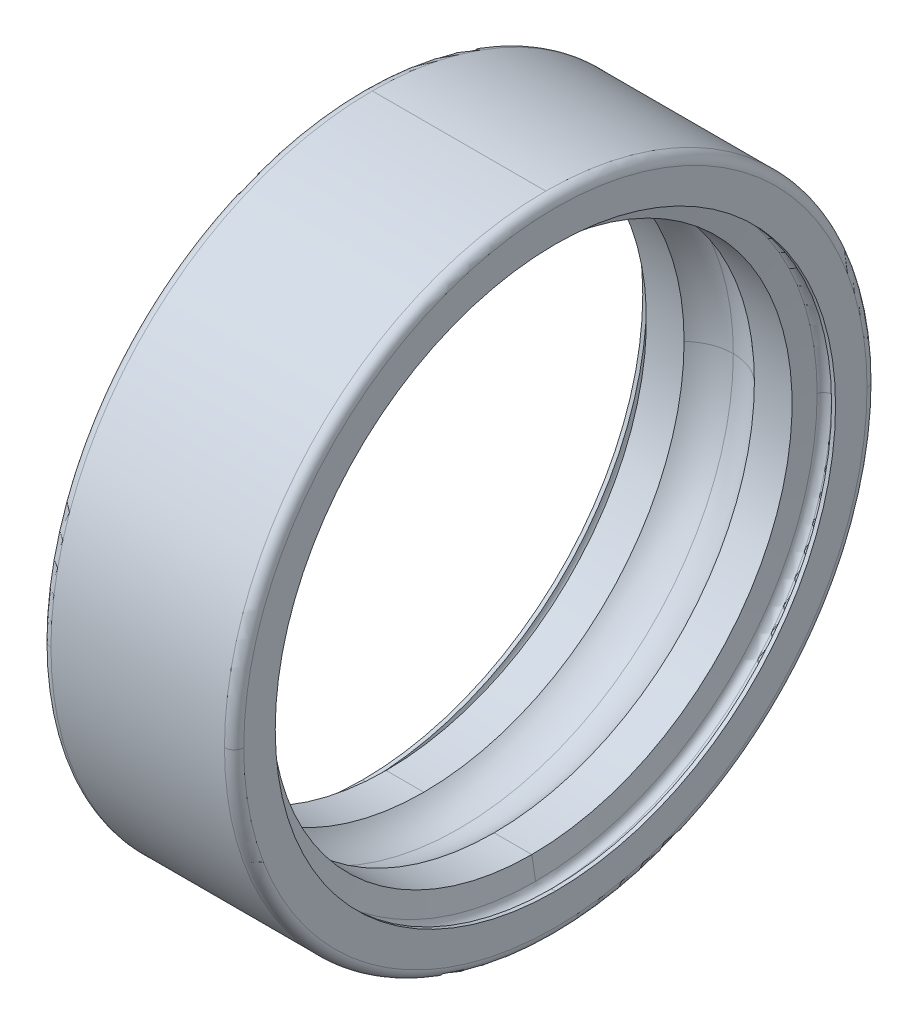
ISO-10303-21;
HEADER;
FILE_DESCRIPTION(('STEP AP214'),'2;1');
FILE_NAME('part.step','',(''),(''),'','','');
FILE_SCHEMA(('AUTOMOTIVE_DESIGN { 1 0 10303 214 1 1 1 1 }'));
ENDSEC;
DATA;
#1=APPLICATION_CONTEXT('core data for automotive mechanical design processes');
#2=APPLICATION_PROTOCOL_DEFINITION('international standard','automotive_design',2000,#1);
#3=PRODUCT_CONTEXT('',#1,'mechanical');
#4=PRODUCT('Part','Part','',(#3));
#5=PRODUCT_RELATED_PRODUCT_CATEGORY('part','',(#4));
#6=PRODUCT_DEFINITION_FORMATION('','',#4);
#7=PRODUCT_DEFINITION_CONTEXT('part definition',#1,'design');
#8=PRODUCT_DEFINITION('design','',#6,#7);
#9=PRODUCT_DEFINITION_SHAPE('','',#8);
#10=(LENGTH_UNIT() NAMED_UNIT(*) SI_UNIT(.MILLI.,.METRE.));
#11=(NAMED_UNIT(*) PLANE_ANGLE_UNIT() SI_UNIT($,.RADIAN.));
#12=(NAMED_UNIT(*) SI_UNIT($,.STERADIAN.) SOLID_ANGLE_UNIT());
#13=UNCERTAINTY_MEASURE_WITH_UNIT(LENGTH_MEASURE(1.E-05),#10,'distance_accuracy_value','');
#14=(GEOMETRIC_REPRESENTATION_CONTEXT(3) GLOBAL_UNCERTAINTY_ASSIGNED_CONTEXT((#13)) GLOBAL_UNIT_ASSIGNED_CONTEXT((#10,
#11,#12)) REPRESENTATION_CONTEXT('',''));
#15=CARTESIAN_POINT('',(0.,0.,0.));
#16=DIRECTION('',(0.,0.,1.));
#17=DIRECTION('',(1.,0.,0.));
#18=AXIS2_PLACEMENT_3D('',#15,#16,#17);
#19=CARTESIAN_POINT('',(5.628,0.,0.));
#20=DIRECTION('',(1.,0.,0.));
#21=DIRECTION('',(0.,0.,-1.));
#22=AXIS2_PLACEMENT_3D('',#19,#20,#21);
#23=TOROIDAL_SURFACE('',#22,8.72,0.248);
#24=CARTESIAN_POINT('',(5.628,0.,0.));
#25=DIRECTION('',(1.,0.,0.));
#26=DIRECTION('',(0.,0.,1.));
#27=AXIS2_PLACEMENT_3D('',#24,#25,#26);
#28=CIRCLE('',#27,8.968);
#29=CARTESIAN_POINT('',(5.628,0.,-8.968));
#30=VERTEX_POINT('',#29);
#31=CARTESIAN_POINT('',(5.628,0.,8.968));
#32=VERTEX_POINT('',#31);
#33=EDGE_CURVE('E185',#30,#32,#28,.T.);
#34=ORIENTED_EDGE('',*,*,#33,.T.);
#35=CARTESIAN_POINT('',(5.628,0.,8.72));
#36=DIRECTION('',(0.,-1.,0.));
#37=DIRECTION('',(0.,0.,1.));
#38=AXIS2_PLACEMENT_3D('',#35,#36,#37);
#39=CIRCLE('',#38,0.248);
#40=CARTESIAN_POINT('',(5.38376767725297,0.,8.7630647480614));
#41=VERTEX_POINT('',#40);
#42=EDGE_CURVE('E198',#32,#41,#39,.T.);
#43=ORIENTED_EDGE('',*,*,#42,.T.);
#44=CARTESIAN_POINT('',(5.38376767725297,0.,0.));
#45=DIRECTION('',(1.,0.,0.));
#46=DIRECTION('',(0.,1.,0.));
#47=AXIS2_PLACEMENT_3D('',#44,#45,#46);
#48=CIRCLE('',#47,8.7630647480614);
#49=CARTESIAN_POINT('',(5.38376767725297,8.7630647480614,0.));
#50=VERTEX_POINT('',#49);
#51=EDGE_CURVE('E32',#50,#41,#48,.T.);
#52=ORIENTED_EDGE('',*,*,#51,.F.);
#53=CARTESIAN_POINT('',(5.38376767725297,0.,0.));
#54=DIRECTION('',(1.,0.,0.));
#55=DIRECTION('',(0.,1.,0.));
#56=AXIS2_PLACEMENT_3D('',#53,#54,#55);
#57=CIRCLE('',#56,8.7630647480614);
#58=CARTESIAN_POINT('',(5.38376767725297,0.,-8.7630647480614));
#59=VERTEX_POINT('',#58);
#60=EDGE_CURVE('E186',#59,#50,#57,.T.);
#61=ORIENTED_EDGE('',*,*,#60,.F.);
#62=CARTESIAN_POINT('',(5.628,0.,-8.72));
#63=DIRECTION('',(0.,-1.,0.));
#64=DIRECTION('',(0.,0.,-1.));
#65=AXIS2_PLACEMENT_3D('',#62,#63,#64);
#66=CIRCLE('',#65,0.248);
#67=EDGE_CURVE('E182',#59,#30,#66,.T.);
#68=ORIENTED_EDGE('',*,*,#67,.T.);
#69=EDGE_LOOP('',(#34,#43,#52,#61,#68));
#70=FACE_BOUND('',#69,.T.);
#71=ADVANCED_FACE('F17',(#70),#23,.F.);
#72=CARTESIAN_POINT('',(5.938,0.,0.));
#73=DIRECTION('',(1.,0.,0.));
#74=DIRECTION('',(0.,1.,0.));
#75=AXIS2_PLACEMENT_3D('',#72,#73,#74);
#76=CYLINDRICAL_SURFACE('',#75,8.72);
#77=DIRECTION('',(1.,0.,0.));
#78=VECTOR('',#77,1.);
#79=CARTESIAN_POINT('',(5.938,8.72,0.));
#80=LINE('',#79,#78);
#81=CARTESIAN_POINT('',(5.876,8.72,0.));
#82=VERTEX_POINT('',#81);
#83=CARTESIAN_POINT('',(6.,8.72,0.));
#84=VERTEX_POINT('',#83);
#85=EDGE_CURVE('E323',#82,#84,#80,.T.);
#86=ORIENTED_EDGE('',*,*,#85,.T.);
#87=CARTESIAN_POINT('',(6.,0.,0.));
#88=DIRECTION('',(1.,0.,0.));
#89=DIRECTION('',(0.,1.,0.));
#90=AXIS2_PLACEMENT_3D('',#87,#88,#89);
#91=CIRCLE('',#90,8.72);
#92=CARTESIAN_POINT('',(6.,-8.72,0.));
#93=VERTEX_POINT('',#92);
#94=EDGE_CURVE('E11',#84,#93,#91,.T.);
#95=ORIENTED_EDGE('',*,*,#94,.T.);
#96=DIRECTION('',(-1.,0.,0.));
#97=VECTOR('',#96,1.);
#98=CARTESIAN_POINT('',(5.938,-8.72,0.));
#99=LINE('',#98,#97);
#100=CARTESIAN_POINT('',(5.876,-8.72,0.));
#101=VERTEX_POINT('',#100);
#102=EDGE_CURVE('E331',#93,#101,#99,.T.);
#103=ORIENTED_EDGE('',*,*,#102,.T.);
#104=CARTESIAN_POINT('',(5.876,0.,0.));
#105=DIRECTION('',(1.,0.,0.));
#106=DIRECTION('',(0.,1.,0.));
#107=AXIS2_PLACEMENT_3D('',#104,#105,#106);
#108=CIRCLE('',#107,8.72);
#109=CARTESIAN_POINT('',(5.876,0.,8.72));
#110=VERTEX_POINT('',#109);
#111=EDGE_CURVE('E202',#110,#101,#108,.T.);
#112=ORIENTED_EDGE('',*,*,#111,.F.);
#113=CARTESIAN_POINT('',(5.876,0.,0.));
#114=DIRECTION('',(1.,0.,0.));
#115=DIRECTION('',(0.,1.,0.));
#116=AXIS2_PLACEMENT_3D('',#113,#114,#115);
#117=CIRCLE('',#116,8.72);
#118=EDGE_CURVE('E233',#82,#110,#117,.T.);
#119=ORIENTED_EDGE('',*,*,#118,.F.);
#120=EDGE_LOOP('',(#86,#95,#103,#112,#119));
#121=FACE_BOUND('',#120,.T.);
#122=ADVANCED_FACE('F428',(#121),#76,.F.);
#123=CARTESIAN_POINT('',(6.,9.21,0.));
#124=DIRECTION('',(1.,0.,0.));
#125=DIRECTION('',(0.,1.,0.));
#126=AXIS2_PLACEMENT_3D('',#123,#124,#125);
#127=PLANE('',#126);
#128=ORIENTED_EDGE('',*,*,#94,.F.);
#129=CARTESIAN_POINT('',(6.,0.,0.));
#130=DIRECTION('',(1.,0.,0.));
#131=DIRECTION('',(0.,1.,0.));
#132=AXIS2_PLACEMENT_3D('',#129,#130,#131);
#133=CIRCLE('',#132,8.72);
#134=EDGE_CURVE('E336',#93,#84,#133,.T.);
#135=ORIENTED_EDGE('',*,*,#134,.F.);
#136=EDGE_LOOP('',(#128,#135));
#137=FACE_BOUND('',#136,.T.);
#138=CARTESIAN_POINT('',(6.,0.,0.));
#139=DIRECTION('',(1.,0.,0.));
#140=DIRECTION('',(0.,1.,0.));
#141=AXIS2_PLACEMENT_3D('',#138,#139,#140);
#142=CIRCLE('',#141,9.7);
#143=CARTESIAN_POINT('',(6.,0.,9.7));
#144=VERTEX_POINT('',#143);
#145=CARTESIAN_POINT('',(6.,0.,-9.7));
#146=VERTEX_POINT('',#145);
#147=EDGE_CURVE('E20',#144,#146,#142,.T.);
#148=ORIENTED_EDGE('',*,*,#147,.T.);
#149=CARTESIAN_POINT('',(6.,0.,0.));
#150=DIRECTION('',(1.,0.,0.));
#151=DIRECTION('',(0.,1.,0.));
#152=AXIS2_PLACEMENT_3D('',#149,#150,#151);
#153=CIRCLE('',#152,9.7);
#154=EDGE_CURVE('E256',#146,#144,#153,.T.);
#155=ORIENTED_EDGE('',*,*,#154,.T.);
#156=EDGE_LOOP('',(#148,#155));
#157=FACE_BOUND('',#156,.T.);
#158=ADVANCED_FACE('F426',(#137,#157),#127,.T.);
#159=CARTESIAN_POINT('',(5.7,0.,0.));
#160=DIRECTION('',(1.,0.,0.));
#161=DIRECTION('',(0.,0.,-1.));
#162=AXIS2_PLACEMENT_3D('',#159,#160,#161);
#163=TOROIDAL_SURFACE('',#162,9.7,0.3);
#164=CARTESIAN_POINT('',(5.7,0.,-9.7));
#165=DIRECTION('',(0.,-1.,0.));
#166=DIRECTION('',(0.,0.,-1.));
#167=AXIS2_PLACEMENT_3D('',#164,#165,#166);
#168=CIRCLE('',#167,0.3);
#169=CARTESIAN_POINT('',(5.7,0.,-10.));
#170=VERTEX_POINT('',#169);
#171=EDGE_CURVE('E339',#170,#146,#168,.T.);
#172=ORIENTED_EDGE('',*,*,#171,.T.);
#173=ORIENTED_EDGE('',*,*,#147,.F.);
#174=CARTESIAN_POINT('',(5.7,0.,9.7));
#175=DIRECTION('',(0.,-1.,0.));
#176=DIRECTION('',(0.,0.,1.));
#177=AXIS2_PLACEMENT_3D('',#174,#175,#176);
#178=CIRCLE('',#177,0.3);
#179=CARTESIAN_POINT('',(5.7,0.,10.));
#180=VERTEX_POINT('',#179);
#181=EDGE_CURVE('E348',#144,#180,#178,.T.);
#182=ORIENTED_EDGE('',*,*,#181,.T.);
#183=CARTESIAN_POINT('',(5.7,0.,0.));
#184=DIRECTION('',(1.,0.,0.));
#185=DIRECTION('',(0.,1.,0.));
#186=AXIS2_PLACEMENT_3D('',#183,#184,#185);
#187=CIRCLE('',#186,10.);
#188=CARTESIAN_POINT('',(5.7,-10.,0.));
#189=VERTEX_POINT('',#188);
#190=EDGE_CURVE('E357',#180,#189,#187,.T.);
#191=ORIENTED_EDGE('',*,*,#190,.T.);
#192=CARTESIAN_POINT('',(5.7,0.,0.));
#193=DIRECTION('',(1.,0.,0.));
#194=DIRECTION('',(0.,1.,0.));
#195=AXIS2_PLACEMENT_3D('',#192,#193,#194);
#196=CIRCLE('',#195,10.);
#197=EDGE_CURVE('E243',#189,#170,#196,.T.);
#198=ORIENTED_EDGE('',*,*,#197,.T.);
#199=EDGE_LOOP('',(#172,#173,#182,#191,#198));
#200=FACE_BOUND('',#199,.T.);
#201=ADVANCED_FACE('F424',(#200),#163,.T.);
#202=CARTESIAN_POINT('',(3.,0.,0.));
#203=DIRECTION('',(1.,0.,0.));
#204=DIRECTION('',(0.,1.,0.));
#205=AXIS2_PLACEMENT_3D('',#202,#203,#204);
#206=CYLINDRICAL_SURFACE('',#205,10.);
#207=DIRECTION('',(1.,0.,0.));
#208=VECTOR('',#207,1.);
#209=CARTESIAN_POINT('',(3.,10.,0.));
#210=LINE('',#209,#208);
#211=CARTESIAN_POINT('',(0.3,10.,0.));
#212=VERTEX_POINT('',#211);
#213=CARTESIAN_POINT('',(5.7,10.,0.));
#214=VERTEX_POINT('',#213);
#215=EDGE_CURVE('E253',#212,#214,#210,.T.);
#216=ORIENTED_EDGE('',*,*,#215,.T.);
#217=CARTESIAN_POINT('',(5.7,0.,0.));
#218=DIRECTION('',(1.,0.,0.));
#219=DIRECTION('',(0.,1.,0.));
#220=AXIS2_PLACEMENT_3D('',#217,#218,#219);
#221=CIRCLE('',#220,10.);
#222=EDGE_CURVE('E342',#170,#214,#221,.T.);
#223=ORIENTED_EDGE('',*,*,#222,.F.);
#224=ORIENTED_EDGE('',*,*,#197,.F.);
#225=DIRECTION('',(-1.,0.,0.));
#226=VECTOR('',#225,1.);
#227=CARTESIAN_POINT('',(3.,-10.,0.));
#228=LINE('',#227,#226);
#229=CARTESIAN_POINT('',(0.3,-10.,0.));
#230=VERTEX_POINT('',#229);
#231=EDGE_CURVE('E271',#189,#230,#228,.T.);
#232=ORIENTED_EDGE('',*,*,#231,.T.);
#233=CARTESIAN_POINT('',(0.3,0.,0.));
#234=DIRECTION('',(1.,0.,0.));
#235=DIRECTION('',(0.,1.,0.));
#236=AXIS2_PLACEMENT_3D('',#233,#234,#235);
#237=CIRCLE('',#236,10.);
#238=CARTESIAN_POINT('',(0.3,0.,-10.));
#239=VERTEX_POINT('',#238);
#240=EDGE_CURVE('E241',#230,#239,#237,.T.);
#241=ORIENTED_EDGE('',*,*,#240,.T.);
#242=CARTESIAN_POINT('',(0.3,0.,0.));
#243=DIRECTION('',(1.,0.,0.));
#244=DIRECTION('',(0.,1.,0.));
#245=AXIS2_PLACEMENT_3D('',#242,#243,#244);
#246=CIRCLE('',#245,10.);
#247=EDGE_CURVE('E374',#239,#212,#246,.T.);
#248=ORIENTED_EDGE('',*,*,#247,.T.);
#249=EDGE_LOOP('',(#216,#223,#224,#232,#241,#248));
#250=FACE_BOUND('',#249,.T.);
#251=ADVANCED_FACE('F412',(#250),#206,.T.);
#252=CARTESIAN_POINT('',(0.3,0.,0.));
#253=DIRECTION('',(1.,0.,0.));
#254=DIRECTION('',(0.,0.,-1.));
#255=AXIS2_PLACEMENT_3D('',#252,#253,#254);
#256=TOROIDAL_SURFACE('',#255,9.7,0.3);
#257=CARTESIAN_POINT('',(0.3,0.,-9.7));
#258=DIRECTION('',(0.,-1.,0.));
#259=DIRECTION('',(0.,0.,-1.));
#260=AXIS2_PLACEMENT_3D('',#257,#258,#259);
#261=CIRCLE('',#260,0.3);
#262=CARTESIAN_POINT('',(0.,0.,-9.7));
#263=VERTEX_POINT('',#262);
#264=EDGE_CURVE('E360',#263,#239,#261,.T.);
#265=ORIENTED_EDGE('',*,*,#264,.T.);
#266=ORIENTED_EDGE('',*,*,#240,.F.);
#267=CARTESIAN_POINT('',(0.3,0.,0.));
#268=DIRECTION('',(1.,0.,0.));
#269=DIRECTION('',(0.,1.,0.));
#270=AXIS2_PLACEMENT_3D('',#267,#268,#269);
#271=CIRCLE('',#270,10.);
#272=CARTESIAN_POINT('',(0.3,0.,10.));
#273=VERTEX_POINT('',#272);
#274=EDGE_CURVE('E268',#273,#230,#271,.T.);
#275=ORIENTED_EDGE('',*,*,#274,.F.);
#276=CARTESIAN_POINT('',(0.3,0.,9.7));
#277=DIRECTION('',(0.,-1.,0.));
#278=DIRECTION('',(0.,0.,1.));
#279=AXIS2_PLACEMENT_3D('',#276,#277,#278);
#280=CIRCLE('',#279,0.3);
#281=CARTESIAN_POINT('',(0.,0.,9.7));
#282=VERTEX_POINT('',#281);
#283=EDGE_CURVE('E371',#273,#282,#280,.T.);
#284=ORIENTED_EDGE('',*,*,#283,.T.);
#285=CARTESIAN_POINT('',(0.,0.,0.));
#286=DIRECTION('',(1.,0.,0.));
#287=DIRECTION('',(0.,1.,0.));
#288=AXIS2_PLACEMENT_3D('',#285,#286,#287);
#289=CIRCLE('',#288,9.7);
#290=EDGE_CURVE('E244',#282,#263,#289,.T.);
#291=ORIENTED_EDGE('',*,*,#290,.T.);
#292=EDGE_LOOP('',(#265,#266,#275,#284,#291));
#293=FACE_BOUND('',#292,.T.);
#294=ADVANCED_FACE('F401',(#293),#256,.T.);
#295=CARTESIAN_POINT('',(0.,9.21,0.));
#296=DIRECTION('',(-1.,0.,0.));
#297=DIRECTION('',(0.,0.,1.));
#298=AXIS2_PLACEMENT_3D('',#295,#296,#297);
#299=PLANE('',#298);
#300=CARTESIAN_POINT('',(0.,0.,0.));
#301=DIRECTION('',(1.,0.,0.));
#302=DIRECTION('',(0.,1.,0.));
#303=AXIS2_PLACEMENT_3D('',#300,#301,#302);
#304=CIRCLE('',#303,8.72);
#305=CARTESIAN_POINT('',(0.,8.72,0.));
#306=VERTEX_POINT('',#305);
#307=CARTESIAN_POINT('',(0.,-8.72,0.));
#308=VERTEX_POINT('',#307);
#309=EDGE_CURVE('E398',#306,#308,#304,.T.);
#310=ORIENTED_EDGE('',*,*,#309,.T.);
#311=CARTESIAN_POINT('',(0.,0.,0.));
#312=DIRECTION('',(1.,0.,0.));
#313=DIRECTION('',(0.,1.,0.));
#314=AXIS2_PLACEMENT_3D('',#311,#312,#313);
#315=CIRCLE('',#314,8.72);
#316=EDGE_CURVE('E282',#308,#306,#315,.T.);
#317=ORIENTED_EDGE('',*,*,#316,.T.);
#318=EDGE_LOOP('',(#310,#317));
#319=FACE_BOUND('',#318,.T.);
#320=CARTESIAN_POINT('',(0.,0.,0.));
#321=DIRECTION('',(1.,0.,0.));
#322=DIRECTION('',(0.,1.,0.));
#323=AXIS2_PLACEMENT_3D('',#320,#321,#322);
#324=CIRCLE('',#323,9.7);
#325=EDGE_CURVE('E366',#263,#282,#324,.T.);
#326=ORIENTED_EDGE('',*,*,#325,.F.);
#327=ORIENTED_EDGE('',*,*,#290,.F.);
#328=EDGE_LOOP('',(#326,#327));
#329=FACE_BOUND('',#328,.T.);
#330=ADVANCED_FACE('F405',(#319,#329),#299,.T.);
#331=CARTESIAN_POINT('',(0.062,0.,0.));
#332=DIRECTION('',(1.,0.,0.));
#333=DIRECTION('',(0.,1.,0.));
#334=AXIS2_PLACEMENT_3D('',#331,#332,#333);
#335=CYLINDRICAL_SURFACE('',#334,8.72);
#336=DIRECTION('',(1.,0.,0.));
#337=VECTOR('',#336,1.);
#338=CARTESIAN_POINT('',(0.062,8.72,0.));
#339=LINE('',#338,#337);
#340=CARTESIAN_POINT('',(0.124,8.72,0.));
#341=VERTEX_POINT('',#340);
#342=EDGE_CURVE('E286',#306,#341,#339,.T.);
#343=ORIENTED_EDGE('',*,*,#342,.T.);
#344=CARTESIAN_POINT('',(0.124,0.,0.));
#345=DIRECTION('',(1.,0.,0.));
#346=DIRECTION('',(0.,1.,0.));
#347=AXIS2_PLACEMENT_3D('',#344,#345,#346);
#348=CIRCLE('',#347,8.72);
#349=CARTESIAN_POINT('',(0.124,0.,8.72));
#350=VERTEX_POINT('',#349);
#351=EDGE_CURVE('E368',#341,#350,#348,.T.);
#352=ORIENTED_EDGE('',*,*,#351,.T.);
#353=CARTESIAN_POINT('',(0.124,0.,0.));
#354=DIRECTION('',(1.,0.,0.));
#355=DIRECTION('',(0.,1.,0.));
#356=AXIS2_PLACEMENT_3D('',#353,#354,#355);
#357=CIRCLE('',#356,8.72);
#358=CARTESIAN_POINT('',(0.124,-8.72,0.));
#359=VERTEX_POINT('',#358);
#360=EDGE_CURVE('E309',#350,#359,#357,.T.);
#361=ORIENTED_EDGE('',*,*,#360,.T.);
#362=DIRECTION('',(-1.,0.,0.));
#363=VECTOR('',#362,1.);
#364=CARTESIAN_POINT('',(0.062,-8.72,0.));
#365=LINE('',#364,#363);
#366=EDGE_CURVE('E285',#359,#308,#365,.T.);
#367=ORIENTED_EDGE('',*,*,#366,.T.);
#368=ORIENTED_EDGE('',*,*,#309,.F.);
#369=EDGE_LOOP('',(#343,#352,#361,#367,#368));
#370=FACE_BOUND('',#369,.T.);
#371=ADVANCED_FACE('F487',(#370),#335,.F.);
#372=CARTESIAN_POINT('',(0.372,0.,0.));
#373=DIRECTION('',(1.,0.,0.));
#374=DIRECTION('',(0.,0.,-1.));
#375=AXIS2_PLACEMENT_3D('',#372,#373,#374);
#376=TOROIDAL_SURFACE('',#375,8.72,0.248);
#377=CARTESIAN_POINT('',(0.372,0.,0.));
#378=DIRECTION('',(1.,0.,0.));
#379=DIRECTION('',(0.,0.,1.));
#380=AXIS2_PLACEMENT_3D('',#377,#378,#379);
#381=CIRCLE('',#380,8.968);
#382=CARTESIAN_POINT('',(0.372,0.,-8.968));
#383=VERTEX_POINT('',#382);
#384=CARTESIAN_POINT('',(0.372,0.,8.968));
#385=VERTEX_POINT('',#384);
#386=EDGE_CURVE('E246',#383,#385,#381,.T.);
#387=ORIENTED_EDGE('',*,*,#386,.T.);
#388=CARTESIAN_POINT('',(0.372,0.,8.72));
#389=DIRECTION('',(0.,-1.,0.));
#390=DIRECTION('',(0.,0.,1.));
#391=AXIS2_PLACEMENT_3D('',#388,#389,#390);
#392=CIRCLE('',#391,0.248);
#393=EDGE_CURVE('E305',#385,#350,#392,.T.);
#394=ORIENTED_EDGE('',*,*,#393,.T.);
#395=ORIENTED_EDGE('',*,*,#351,.F.);
#396=CARTESIAN_POINT('',(0.124,0.,0.));
#397=DIRECTION('',(1.,0.,0.));
#398=DIRECTION('',(0.,1.,0.));
#399=AXIS2_PLACEMENT_3D('',#396,#397,#398);
#400=CIRCLE('',#399,8.72);
#401=CARTESIAN_POINT('',(0.124,0.,-8.72));
#402=VERTEX_POINT('',#401);
#403=EDGE_CURVE('E298',#402,#341,#400,.T.);
#404=ORIENTED_EDGE('',*,*,#403,.F.);
#405=CARTESIAN_POINT('',(0.372,0.,-8.72));
#406=DIRECTION('',(0.,-1.,0.));
#407=DIRECTION('',(0.,0.,-1.));
#408=AXIS2_PLACEMENT_3D('',#405,#406,#407);
#409=CIRCLE('',#408,0.248);
#410=EDGE_CURVE('E301',#402,#383,#409,.T.);
#411=ORIENTED_EDGE('',*,*,#410,.T.);
#412=EDGE_LOOP('',(#387,#394,#395,#404,#411));
#413=FACE_BOUND('',#412,.T.);
#414=ADVANCED_FACE('F497',(#413),#376,.F.);
#415=CARTESIAN_POINT('',(0.674690425266971,0.,0.));
#416=DIRECTION('',(-1.,0.,0.));
#417=DIRECTION('',(0.,1.,0.));
#418=AXIS2_PLACEMENT_3D('',#415,#416,#417);
#419=CONICAL_SURFACE('',#418,8.4315323740307,1.39626340159546);
#420=DIRECTION('',(0.173648177666931,-0.984807753012208,0.));
#421=VECTOR('',#420,1.);
#422=CARTESIAN_POINT('',(0.674690425266971,8.4315323740307,0.));
#423=LINE('',#422,#421);
#424=CARTESIAN_POINT('',(0.616232322747028,8.7630647480614,0.));
#425=VERTEX_POINT('',#424);
#426=CARTESIAN_POINT('',(0.733148527786914,8.1,0.));
#427=VERTEX_POINT('',#426);
#428=EDGE_CURVE('E308',#425,#427,#423,.T.);
#429=ORIENTED_EDGE('',*,*,#428,.T.);
#430=CARTESIAN_POINT('',(0.733148527786915,0.,0.));
#431=DIRECTION('',(1.,0.,0.));
#432=DIRECTION('',(0.,1.,0.));
#433=AXIS2_PLACEMENT_3D('',#430,#431,#432);
#434=CIRCLE('',#433,8.1);
#435=CARTESIAN_POINT('',(0.733148527786915,-8.1,0.));
#436=VERTEX_POINT('',#435);
#437=EDGE_CURVE('E363',#427,#436,#434,.T.);
#438=ORIENTED_EDGE('',*,*,#437,.T.);
#439=DIRECTION('',(-0.173648177666931,-0.984807753012208,0.));
#440=VECTOR('',#439,1.);
#441=CARTESIAN_POINT('',(0.674690425266971,-8.4315323740307,0.));
#442=LINE('',#441,#440);
#443=CARTESIAN_POINT('',(0.616232322747028,-8.7630647480614,0.));
#444=VERTEX_POINT('',#443);
#445=EDGE_CURVE('E312',#436,#444,#442,.T.);
#446=ORIENTED_EDGE('',*,*,#445,.T.);
#447=CARTESIAN_POINT('',(0.616232322747028,0.,0.));
#448=DIRECTION('',(1.,0.,0.));
#449=DIRECTION('',(0.,1.,0.));
#450=AXIS2_PLACEMENT_3D('',#447,#448,#449);
#451=CIRCLE('',#450,8.7630647480614);
#452=CARTESIAN_POINT('',(0.616232322747028,0.,8.7630647480614));
#453=VERTEX_POINT('',#452);
#454=EDGE_CURVE('E297',#453,#444,#451,.T.);
#455=ORIENTED_EDGE('',*,*,#454,.F.);
#456=CARTESIAN_POINT('',(0.616232322747028,0.,0.));
#457=DIRECTION('',(1.,0.,0.));
#458=DIRECTION('',(0.,1.,0.));
#459=AXIS2_PLACEMENT_3D('',#456,#457,#458);
#460=CIRCLE('',#459,8.7630647480614);
#461=EDGE_CURVE('E262',#425,#453,#460,.T.);
#462=ORIENTED_EDGE('',*,*,#461,.F.);
#463=EDGE_LOOP('',(#429,#438,#446,#455,#462));
#464=FACE_BOUND('',#463,.T.);
#465=ADVANCED_FACE('F507',(#464),#419,.F.);
#466=CARTESIAN_POINT('',(1.31938685312819,0.,0.));
#467=DIRECTION('',(1.,0.,0.));
#468=DIRECTION('',(0.,1.,0.));
#469=AXIS2_PLACEMENT_3D('',#466,#467,#468);
#470=CYLINDRICAL_SURFACE('',#469,8.1);
#471=DIRECTION('',(1.,0.,0.));
#472=VECTOR('',#471,1.);
#473=CARTESIAN_POINT('',(1.31938685312819,8.1,0.));
#474=LINE('',#473,#472);
#475=CARTESIAN_POINT('',(1.90562517846946,8.1,0.));
#476=VERTEX_POINT('',#475);
#477=EDGE_CURVE('E317',#427,#476,#474,.T.);
#478=ORIENTED_EDGE('',*,*,#477,.T.);
#479=CARTESIAN_POINT('',(1.90562517846946,0.,0.));
#480=DIRECTION('',(1.,0.,0.));
#481=DIRECTION('',(0.,1.,0.));
#482=AXIS2_PLACEMENT_3D('',#479,#480,#481);
#483=CIRCLE('',#482,8.1);
#484=CARTESIAN_POINT('',(1.90562517846946,0.,8.1));
#485=VERTEX_POINT('',#484);
#486=EDGE_CURVE('E361',#476,#485,#483,.T.);
#487=ORIENTED_EDGE('',*,*,#486,.T.);
#488=CARTESIAN_POINT('',(1.90562517846946,0.,0.));
#489=DIRECTION('',(1.,0.,0.));
#490=DIRECTION('',(0.,1.,0.));
#491=AXIS2_PLACEMENT_3D('',#488,#489,#490);
#492=CIRCLE('',#491,8.1);
#493=CARTESIAN_POINT('',(1.90562517846946,-8.1,0.));
#494=VERTEX_POINT('',#493);
#495=EDGE_CURVE('E249',#485,#494,#492,.T.);
#496=ORIENTED_EDGE('',*,*,#495,.T.);
#497=DIRECTION('',(-1.,0.,0.));
#498=VECTOR('',#497,1.);
#499=CARTESIAN_POINT('',(1.31938685312819,-8.1,0.));
#500=LINE('',#499,#498);
#501=EDGE_CURVE('E328',#494,#436,#500,.T.);
#502=ORIENTED_EDGE('',*,*,#501,.T.);
#503=ORIENTED_EDGE('',*,*,#437,.F.);
#504=EDGE_LOOP('',(#478,#487,#496,#502,#503));
#505=FACE_BOUND('',#504,.T.);
#506=ADVANCED_FACE('F517',(#505),#470,.F.);
#507=CARTESIAN_POINT('',(3.,0.,0.));
#508=DIRECTION('',(1.,0.,0.));
#509=DIRECTION('',(0.,0.,-1.));
#510=AXIS2_PLACEMENT_3D('',#507,#508,#509);
#511=TOROIDAL_SURFACE('',#510,6.95,1.5875);
#512=CARTESIAN_POINT('',(3.,0.,0.));
#513=DIRECTION('',(1.,0.,0.));
#514=DIRECTION('',(0.,0.,1.));
#515=AXIS2_PLACEMENT_3D('',#512,#513,#514);
#516=CIRCLE('',#515,8.5375);
#517=CARTESIAN_POINT('',(3.,0.,-8.5375));
#518=VERTEX_POINT('',#517);
#519=CARTESIAN_POINT('',(3.,0.,8.5375));
#520=VERTEX_POINT('',#519);
#521=EDGE_CURVE('E240',#518,#520,#516,.T.);
#522=ORIENTED_EDGE('',*,*,#521,.T.);
#523=CARTESIAN_POINT('',(3.,0.,6.95));
#524=DIRECTION('',(0.,-1.,0.));
#525=DIRECTION('',(0.,0.,1.));
#526=AXIS2_PLACEMENT_3D('',#523,#524,#525);
#527=CIRCLE('',#526,1.5875);
#528=EDGE_CURVE('E228',#520,#485,#527,.T.);
#529=ORIENTED_EDGE('',*,*,#528,.T.);
#530=ORIENTED_EDGE('',*,*,#486,.F.);
#531=CARTESIAN_POINT('',(1.90562517846946,0.,0.));
#532=DIRECTION('',(1.,0.,0.));
#533=DIRECTION('',(0.,1.,0.));
#534=AXIS2_PLACEMENT_3D('',#531,#532,#533);
#535=CIRCLE('',#534,8.1);
#536=CARTESIAN_POINT('',(1.90562517846946,0.,-8.1));
#537=VERTEX_POINT('',#536);
#538=EDGE_CURVE('E327',#537,#476,#535,.T.);
#539=ORIENTED_EDGE('',*,*,#538,.F.);
#540=CARTESIAN_POINT('',(3.,0.,-6.95));
#541=DIRECTION('',(0.,-1.,0.));
#542=DIRECTION('',(0.,0.,-1.));
#543=AXIS2_PLACEMENT_3D('',#540,#541,#542);
#544=CIRCLE('',#543,1.5875);
#545=EDGE_CURVE('E334',#537,#518,#544,.T.);
#546=ORIENTED_EDGE('',*,*,#545,.T.);
#547=EDGE_LOOP('',(#522,#529,#530,#539,#546));
#548=FACE_BOUND('',#547,.T.);
#549=ADVANCED_FACE('F527',(#548),#511,.F.);
#550=CARTESIAN_POINT('',(4.68061314687181,0.,0.));
#551=DIRECTION('',(1.,0.,0.));
#552=DIRECTION('',(0.,1.,0.));
#553=AXIS2_PLACEMENT_3D('',#550,#551,#552);
#554=CYLINDRICAL_SURFACE('',#553,8.1);
#555=DIRECTION('',(1.,0.,0.));
#556=VECTOR('',#555,1.);
#557=CARTESIAN_POINT('',(4.68061314687181,8.1,0.));
#558=LINE('',#557,#556);
#559=CARTESIAN_POINT('',(4.09437482153054,8.1,0.));
#560=VERTEX_POINT('',#559);
#561=CARTESIAN_POINT('',(5.26685147221309,8.1,0.));
#562=VERTEX_POINT('',#561);
#563=EDGE_CURVE('E226',#560,#562,#558,.T.);
#564=ORIENTED_EDGE('',*,*,#563,.T.);
#565=CARTESIAN_POINT('',(5.26685147221309,0.,0.));
#566=DIRECTION('',(1.,0.,0.));
#567=DIRECTION('',(0.,1.,0.));
#568=AXIS2_PLACEMENT_3D('',#565,#566,#567);
#569=CIRCLE('',#568,8.1);
#570=CARTESIAN_POINT('',(5.26685147221309,-8.1,0.));
#571=VERTEX_POINT('',#570);
#572=EDGE_CURVE('E40',#562,#571,#569,.T.);
#573=ORIENTED_EDGE('',*,*,#572,.T.);
#574=DIRECTION('',(-1.,0.,0.));
#575=VECTOR('',#574,1.);
#576=CARTESIAN_POINT('',(4.68061314687181,-8.1,0.));
#577=LINE('',#576,#575);
#578=CARTESIAN_POINT('',(4.09437482153054,-8.1,0.));
#579=VERTEX_POINT('',#578);
#580=EDGE_CURVE('E227',#571,#579,#577,.T.);
#581=ORIENTED_EDGE('',*,*,#580,.T.);
#582=CARTESIAN_POINT('',(4.09437482153054,0.,0.));
#583=DIRECTION('',(1.,0.,0.));
#584=DIRECTION('',(0.,1.,0.));
#585=AXIS2_PLACEMENT_3D('',#582,#583,#584);
#586=CIRCLE('',#585,8.1);
#587=CARTESIAN_POINT('',(4.09437482153054,0.,8.1));
#588=VERTEX_POINT('',#587);
#589=EDGE_CURVE('E266',#588,#579,#586,.T.);
#590=ORIENTED_EDGE('',*,*,#589,.F.);
#591=CARTESIAN_POINT('',(4.09437482153054,0.,0.));
#592=DIRECTION('',(1.,0.,0.));
#593=DIRECTION('',(0.,1.,0.));
#594=AXIS2_PLACEMENT_3D('',#591,#592,#593);
#595=CIRCLE('',#594,8.1);
#596=EDGE_CURVE('E221',#560,#588,#595,.T.);
#597=ORIENTED_EDGE('',*,*,#596,.F.);
#598=EDGE_LOOP('',(#564,#573,#581,#590,#597));
#599=FACE_BOUND('',#598,.T.);
#600=ADVANCED_FACE('F537',(#599),#554,.F.);
#601=CARTESIAN_POINT('',(5.32530957473303,0.,0.));
#602=DIRECTION('',(1.,0.,0.));
#603=DIRECTION('',(0.,1.,0.));
#604=AXIS2_PLACEMENT_3D('',#601,#602,#603);
#605=CONICAL_SURFACE('',#604,8.4315323740307,1.39626340159546);
#606=DIRECTION('',(0.17364817766693,0.984807753012208,0.));
#607=VECTOR('',#606,1.);
#608=CARTESIAN_POINT('',(5.32530957473303,8.4315323740307,0.));
#609=LINE('',#608,#607);
#610=EDGE_CURVE('E236',#562,#50,#609,.T.);
#611=ORIENTED_EDGE('',*,*,#610,.T.);
#612=ORIENTED_EDGE('',*,*,#51,.T.);
#613=CARTESIAN_POINT('',(5.38376767725297,0.,0.));
#614=DIRECTION('',(1.,0.,0.));
#615=DIRECTION('',(0.,1.,0.));
#616=AXIS2_PLACEMENT_3D('',#613,#614,#615);
#617=CIRCLE('',#616,8.7630647480614);
#618=CARTESIAN_POINT('',(5.38376767725297,-8.7630647480614,0.));
#619=VERTEX_POINT('',#618);
#620=EDGE_CURVE('E319',#41,#619,#617,.T.);
#621=ORIENTED_EDGE('',*,*,#620,.T.);
#622=DIRECTION('',(-0.17364817766693,0.984807753012208,0.));
#623=VECTOR('',#622,1.);
#624=CARTESIAN_POINT('',(5.32530957473303,-8.4315323740307,0.));
#625=LINE('',#624,#623);
#626=EDGE_CURVE('E393',#619,#571,#625,.T.);
#627=ORIENTED_EDGE('',*,*,#626,.T.);
#628=ORIENTED_EDGE('',*,*,#572,.F.);
#629=EDGE_LOOP('',(#611,#612,#621,#627,#628));
#630=FACE_BOUND('',#629,.T.);
#631=ADVANCED_FACE('F546',(#630),#605,.F.);
#632=CARTESIAN_POINT('',(5.32530957473303,0.,0.));
#633=DIRECTION('',(1.,0.,0.));
#634=DIRECTION('',(0.,1.,0.));
#635=AXIS2_PLACEMENT_3D('',#632,#633,#634);
#636=CONICAL_SURFACE('',#635,8.4315323740307,1.39626340159546);
#637=ORIENTED_EDGE('',*,*,#610,.F.);
#638=CARTESIAN_POINT('',(5.26685147221309,0.,0.));
#639=DIRECTION('',(1.,0.,0.));
#640=DIRECTION('',(0.,1.,0.));
#641=AXIS2_PLACEMENT_3D('',#638,#639,#640);
#642=CIRCLE('',#641,8.1);
#643=EDGE_CURVE('E231',#571,#562,#642,.T.);
#644=ORIENTED_EDGE('',*,*,#643,.F.);
#645=ORIENTED_EDGE('',*,*,#626,.F.);
#646=CARTESIAN_POINT('',(5.38376767725297,0.,0.));
#647=DIRECTION('',(1.,0.,0.));
#648=DIRECTION('',(0.,1.,0.));
#649=AXIS2_PLACEMENT_3D('',#646,#647,#648);
#650=CIRCLE('',#649,8.7630647480614);
#651=EDGE_CURVE('E190',#619,#59,#650,.T.);
#652=ORIENTED_EDGE('',*,*,#651,.T.);
#653=ORIENTED_EDGE('',*,*,#60,.T.);
#654=EDGE_LOOP('',(#637,#644,#645,#652,#653));
#655=FACE_BOUND('',#654,.T.);
#656=ADVANCED_FACE('F555',(#655),#636,.F.);
#657=CARTESIAN_POINT('',(4.68061314687181,0.,0.));
#658=DIRECTION('',(1.,0.,0.));
#659=DIRECTION('',(0.,1.,0.));
#660=AXIS2_PLACEMENT_3D('',#657,#658,#659);
#661=CYLINDRICAL_SURFACE('',#660,8.1);
#662=ORIENTED_EDGE('',*,*,#563,.F.);
#663=CARTESIAN_POINT('',(4.09437482153054,0.,0.));
#664=DIRECTION('',(1.,0.,0.));
#665=DIRECTION('',(0.,1.,0.));
#666=AXIS2_PLACEMENT_3D('',#663,#664,#665);
#667=CIRCLE('',#666,8.1);
#668=CARTESIAN_POINT('',(4.09437482153054,0.,-8.1));
#669=VERTEX_POINT('',#668);
#670=EDGE_CURVE('E222',#669,#560,#667,.T.);
#671=ORIENTED_EDGE('',*,*,#670,.F.);
#672=CARTESIAN_POINT('',(4.09437482153054,0.,0.));
#673=DIRECTION('',(1.,0.,0.));
#674=DIRECTION('',(0.,1.,0.));
#675=AXIS2_PLACEMENT_3D('',#672,#673,#674);
#676=CIRCLE('',#675,8.1);
#677=EDGE_CURVE('E289',#579,#669,#676,.T.);
#678=ORIENTED_EDGE('',*,*,#677,.F.);
#679=ORIENTED_EDGE('',*,*,#580,.F.);
#680=ORIENTED_EDGE('',*,*,#643,.T.);
#681=EDGE_LOOP('',(#662,#671,#678,#679,#680));
#682=FACE_BOUND('',#681,.T.);
#683=ADVANCED_FACE('F565',(#682),#661,.F.);
#684=CARTESIAN_POINT('',(3.,0.,0.));
#685=DIRECTION('',(1.,0.,0.));
#686=DIRECTION('',(0.,0.,-1.));
#687=AXIS2_PLACEMENT_3D('',#684,#685,#686);
#688=TOROIDAL_SURFACE('',#687,6.95,1.5875);
#689=CARTESIAN_POINT('',(3.,0.,0.));
#690=DIRECTION('',(1.,0.,0.));
#691=DIRECTION('',(0.,0.,1.));
#692=AXIS2_PLACEMENT_3D('',#689,#690,#691);
#693=CIRCLE('',#692,8.5375);
#694=EDGE_CURVE('E263',#520,#518,#693,.T.);
#695=ORIENTED_EDGE('',*,*,#694,.T.);
#696=ORIENTED_EDGE('',*,*,#545,.F.);
#697=CARTESIAN_POINT('',(1.90562517846946,0.,0.));
#698=DIRECTION('',(1.,0.,0.));
#699=DIRECTION('',(0.,1.,0.));
#700=AXIS2_PLACEMENT_3D('',#697,#698,#699);
#701=CIRCLE('',#700,8.1);
#702=EDGE_CURVE('E324',#494,#537,#701,.T.);
#703=ORIENTED_EDGE('',*,*,#702,.F.);
#704=ORIENTED_EDGE('',*,*,#495,.F.);
#705=ORIENTED_EDGE('',*,*,#528,.F.);
#706=EDGE_LOOP('',(#695,#696,#703,#704,#705));
#707=FACE_BOUND('',#706,.T.);
#708=ADVANCED_FACE('F575',(#707),#688,.F.);
#709=CARTESIAN_POINT('',(1.31938685312819,0.,0.));
#710=DIRECTION('',(1.,0.,0.));
#711=DIRECTION('',(0.,1.,0.));
#712=AXIS2_PLACEMENT_3D('',#709,#710,#711);
#713=CYLINDRICAL_SURFACE('',#712,8.1);
#714=ORIENTED_EDGE('',*,*,#477,.F.);
#715=CARTESIAN_POINT('',(0.733148527786915,0.,0.));
#716=DIRECTION('',(1.,0.,0.));
#717=DIRECTION('',(0.,1.,0.));
#718=AXIS2_PLACEMENT_3D('',#715,#716,#717);
#719=CIRCLE('',#718,8.1);
#720=EDGE_CURVE('E313',#436,#427,#719,.T.);
#721=ORIENTED_EDGE('',*,*,#720,.F.);
#722=ORIENTED_EDGE('',*,*,#501,.F.);
#723=ORIENTED_EDGE('',*,*,#702,.T.);
#724=ORIENTED_EDGE('',*,*,#538,.T.);
#725=EDGE_LOOP('',(#714,#721,#722,#723,#724));
#726=FACE_BOUND('',#725,.T.);
#727=ADVANCED_FACE('F585',(#726),#713,.F.);
#728=CARTESIAN_POINT('',(0.674690425266971,0.,0.));
#729=DIRECTION('',(-1.,0.,0.));
#730=DIRECTION('',(0.,1.,0.));
#731=AXIS2_PLACEMENT_3D('',#728,#729,#730);
#732=CONICAL_SURFACE('',#731,8.4315323740307,1.39626340159546);
#733=ORIENTED_EDGE('',*,*,#428,.F.);
#734=CARTESIAN_POINT('',(0.616232322747028,0.,0.));
#735=DIRECTION('',(1.,0.,0.));
#736=DIRECTION('',(0.,1.,0.));
#737=AXIS2_PLACEMENT_3D('',#734,#735,#736);
#738=CIRCLE('',#737,8.7630647480614);
#739=CARTESIAN_POINT('',(0.616232322747028,0.,-8.7630647480614));
#740=VERTEX_POINT('',#739);
#741=EDGE_CURVE('E259',#740,#425,#738,.T.);
#742=ORIENTED_EDGE('',*,*,#741,.F.);
#743=CARTESIAN_POINT('',(0.616232322747028,0.,0.));
#744=DIRECTION('',(1.,0.,0.));
#745=DIRECTION('',(0.,1.,0.));
#746=AXIS2_PLACEMENT_3D('',#743,#744,#745);
#747=CIRCLE('',#746,8.7630647480614);
#748=EDGE_CURVE('E203',#444,#740,#747,.T.);
#749=ORIENTED_EDGE('',*,*,#748,.F.);
#750=ORIENTED_EDGE('',*,*,#445,.F.);
#751=ORIENTED_EDGE('',*,*,#720,.T.);
#752=EDGE_LOOP('',(#733,#742,#749,#750,#751));
#753=FACE_BOUND('',#752,.T.);
#754=ADVANCED_FACE('F595',(#753),#732,.F.);
#755=CARTESIAN_POINT('',(0.372,0.,0.));
#756=DIRECTION('',(1.,0.,0.));
#757=DIRECTION('',(0.,0.,-1.));
#758=AXIS2_PLACEMENT_3D('',#755,#756,#757);
#759=TOROIDAL_SURFACE('',#758,8.72,0.248);
#760=CARTESIAN_POINT('',(0.372,0.,0.));
#761=DIRECTION('',(1.,0.,0.));
#762=DIRECTION('',(0.,0.,1.));
#763=AXIS2_PLACEMENT_3D('',#760,#761,#762);
#764=CIRCLE('',#763,8.968);
#765=EDGE_CURVE('E294',#385,#383,#764,.T.);
#766=ORIENTED_EDGE('',*,*,#765,.T.);
#767=ORIENTED_EDGE('',*,*,#410,.F.);
#768=CARTESIAN_POINT('',(0.124,0.,0.));
#769=DIRECTION('',(1.,0.,0.));
#770=DIRECTION('',(0.,1.,0.));
#771=AXIS2_PLACEMENT_3D('',#768,#769,#770);
#772=CIRCLE('',#771,8.72);
#773=EDGE_CURVE('E292',#359,#402,#772,.T.);
#774=ORIENTED_EDGE('',*,*,#773,.F.);
#775=ORIENTED_EDGE('',*,*,#360,.F.);
#776=ORIENTED_EDGE('',*,*,#393,.F.);
#777=EDGE_LOOP('',(#766,#767,#774,#775,#776));
#778=FACE_BOUND('',#777,.T.);
#779=ADVANCED_FACE('F604',(#778),#759,.F.);
#780=CARTESIAN_POINT('',(0.062,0.,0.));
#781=DIRECTION('',(1.,0.,0.));
#782=DIRECTION('',(0.,1.,0.));
#783=AXIS2_PLACEMENT_3D('',#780,#781,#782);
#784=CYLINDRICAL_SURFACE('',#783,8.72);
#785=ORIENTED_EDGE('',*,*,#342,.F.);
#786=ORIENTED_EDGE('',*,*,#316,.F.);
#787=ORIENTED_EDGE('',*,*,#366,.F.);
#788=ORIENTED_EDGE('',*,*,#773,.T.);
#789=ORIENTED_EDGE('',*,*,#403,.T.);
#790=EDGE_LOOP('',(#785,#786,#787,#788,#789));
#791=FACE_BOUND('',#790,.T.);
#792=ADVANCED_FACE('F614',(#791),#784,.F.);
#793=CARTESIAN_POINT('',(0.3,0.,0.));
#794=DIRECTION('',(1.,0.,0.));
#795=DIRECTION('',(0.,0.,-1.));
#796=AXIS2_PLACEMENT_3D('',#793,#794,#795);
#797=TOROIDAL_SURFACE('',#796,9.7,0.3);
#798=ORIENTED_EDGE('',*,*,#264,.F.);
#799=ORIENTED_EDGE('',*,*,#325,.T.);
#800=ORIENTED_EDGE('',*,*,#283,.F.);
#801=CARTESIAN_POINT('',(0.3,0.,0.));
#802=DIRECTION('',(1.,0.,0.));
#803=DIRECTION('',(0.,1.,0.));
#804=AXIS2_PLACEMENT_3D('',#801,#802,#803);
#805=CIRCLE('',#804,10.);
#806=EDGE_CURVE('E255',#212,#273,#805,.T.);
#807=ORIENTED_EDGE('',*,*,#806,.F.);
#808=ORIENTED_EDGE('',*,*,#247,.F.);
#809=EDGE_LOOP('',(#798,#799,#800,#807,#808));
#810=FACE_BOUND('',#809,.T.);
#811=ADVANCED_FACE('F408',(#810),#797,.T.);
#812=CARTESIAN_POINT('',(3.,0.,0.));
#813=DIRECTION('',(1.,0.,0.));
#814=DIRECTION('',(0.,1.,0.));
#815=AXIS2_PLACEMENT_3D('',#812,#813,#814);
#816=CYLINDRICAL_SURFACE('',#815,10.);
#817=ORIENTED_EDGE('',*,*,#215,.F.);
#818=ORIENTED_EDGE('',*,*,#806,.T.);
#819=ORIENTED_EDGE('',*,*,#274,.T.);
#820=ORIENTED_EDGE('',*,*,#231,.F.);
#821=ORIENTED_EDGE('',*,*,#190,.F.);
#822=CARTESIAN_POINT('',(5.7,0.,0.));
#823=DIRECTION('',(1.,0.,0.));
#824=DIRECTION('',(0.,1.,0.));
#825=AXIS2_PLACEMENT_3D('',#822,#823,#824);
#826=CIRCLE('',#825,10.);
#827=EDGE_CURVE('E345',#214,#180,#826,.T.);
#828=ORIENTED_EDGE('',*,*,#827,.F.);
#829=EDGE_LOOP('',(#817,#818,#819,#820,#821,#828));
#830=FACE_BOUND('',#829,.T.);
#831=ADVANCED_FACE('F417',(#830),#816,.T.);
#832=CARTESIAN_POINT('',(5.7,0.,0.));
#833=DIRECTION('',(1.,0.,0.));
#834=DIRECTION('',(0.,0.,-1.));
#835=AXIS2_PLACEMENT_3D('',#832,#833,#834);
#836=TOROIDAL_SURFACE('',#835,9.7,0.3);
#837=ORIENTED_EDGE('',*,*,#171,.F.);
#838=ORIENTED_EDGE('',*,*,#222,.T.);
#839=ORIENTED_EDGE('',*,*,#827,.T.);
#840=ORIENTED_EDGE('',*,*,#181,.F.);
#841=ORIENTED_EDGE('',*,*,#154,.F.);
#842=EDGE_LOOP('',(#837,#838,#839,#840,#841));
#843=FACE_BOUND('',#842,.T.);
#844=ADVANCED_FACE('F421',(#843),#836,.T.);
#845=CARTESIAN_POINT('',(5.938,0.,0.));
#846=DIRECTION('',(1.,0.,0.));
#847=DIRECTION('',(0.,1.,0.));
#848=AXIS2_PLACEMENT_3D('',#845,#846,#847);
#849=CYLINDRICAL_SURFACE('',#848,8.72);
#850=ORIENTED_EDGE('',*,*,#85,.F.);
#851=CARTESIAN_POINT('',(5.876,0.,0.));
#852=DIRECTION('',(1.,0.,0.));
#853=DIRECTION('',(0.,1.,0.));
#854=AXIS2_PLACEMENT_3D('',#851,#852,#853);
#855=CIRCLE('',#854,8.72);
#856=CARTESIAN_POINT('',(5.876,0.,-8.72));
#857=VERTEX_POINT('',#856);
#858=EDGE_CURVE('E213',#857,#82,#855,.T.);
#859=ORIENTED_EDGE('',*,*,#858,.F.);
#860=CARTESIAN_POINT('',(5.876,0.,0.));
#861=DIRECTION('',(1.,0.,0.));
#862=DIRECTION('',(0.,1.,0.));
#863=AXIS2_PLACEMENT_3D('',#860,#861,#862);
#864=CIRCLE('',#863,8.72);
#865=EDGE_CURVE('E191',#101,#857,#864,.T.);
#866=ORIENTED_EDGE('',*,*,#865,.F.);
#867=ORIENTED_EDGE('',*,*,#102,.F.);
#868=ORIENTED_EDGE('',*,*,#134,.T.);
#869=EDGE_LOOP('',(#850,#859,#866,#867,#868));
#870=FACE_BOUND('',#869,.T.);
#871=ADVANCED_FACE('F649',(#870),#849,.F.);
#872=CARTESIAN_POINT('',(5.628,0.,0.));
#873=DIRECTION('',(1.,0.,0.));
#874=DIRECTION('',(0.,0.,-1.));
#875=AXIS2_PLACEMENT_3D('',#872,#873,#874);
#876=TOROIDAL_SURFACE('',#875,8.72,0.248);
#877=CARTESIAN_POINT('',(5.628,0.,0.));
#878=DIRECTION('',(1.,0.,0.));
#879=DIRECTION('',(0.,0.,1.));
#880=AXIS2_PLACEMENT_3D('',#877,#878,#879);
#881=CIRCLE('',#880,8.968);
#882=EDGE_CURVE('E194',#32,#30,#881,.T.);
#883=ORIENTED_EDGE('',*,*,#882,.T.);
#884=ORIENTED_EDGE('',*,*,#67,.F.);
#885=ORIENTED_EDGE('',*,*,#651,.F.);
#886=ORIENTED_EDGE('',*,*,#620,.F.);
#887=ORIENTED_EDGE('',*,*,#42,.F.);
#888=EDGE_LOOP('',(#883,#884,#885,#886,#887));
#889=FACE_BOUND('',#888,.T.);
#890=ADVANCED_FACE('F196',(#889),#876,.F.);
#891=CARTESIAN_POINT('',(5.628,0.,0.));
#892=DIRECTION('',(1.,0.,0.));
#893=DIRECTION('',(0.,0.,-1.));
#894=AXIS2_PLACEMENT_3D('',#891,#892,#893);
#895=TOROIDAL_SURFACE('',#894,8.72,0.248);
#896=ORIENTED_EDGE('',*,*,#882,.F.);
#897=CARTESIAN_POINT('',(5.628,0.,8.72));
#898=DIRECTION('',(0.,-1.,0.));
#899=DIRECTION('',(0.,0.,1.));
#900=AXIS2_PLACEMENT_3D('',#897,#898,#899);
#901=CIRCLE('',#900,0.248);
#902=EDGE_CURVE('E217',#110,#32,#901,.T.);
#903=ORIENTED_EDGE('',*,*,#902,.F.);
#904=ORIENTED_EDGE('',*,*,#111,.T.);
#905=ORIENTED_EDGE('',*,*,#865,.T.);
#906=CARTESIAN_POINT('',(5.628,0.,-8.72));
#907=DIRECTION('',(0.,-1.,0.));
#908=DIRECTION('',(0.,0.,-1.));
#909=AXIS2_PLACEMENT_3D('',#906,#907,#908);
#910=CIRCLE('',#909,0.248);
#911=EDGE_CURVE('E206',#30,#857,#910,.T.);
#912=ORIENTED_EDGE('',*,*,#911,.F.);
#913=EDGE_LOOP('',(#896,#903,#904,#905,#912));
#914=FACE_BOUND('',#913,.T.);
#915=ADVANCED_FACE('F207',(#914),#895,.F.);
#916=CARTESIAN_POINT('',(0.372,0.,0.));
#917=DIRECTION('',(1.,0.,0.));
#918=DIRECTION('',(0.,0.,-1.));
#919=AXIS2_PLACEMENT_3D('',#916,#917,#918);
#920=TOROIDAL_SURFACE('',#919,8.72,0.248);
#921=ORIENTED_EDGE('',*,*,#765,.F.);
#922=CARTESIAN_POINT('',(0.372,0.,8.72));
#923=DIRECTION('',(0.,-1.,0.));
#924=DIRECTION('',(0.,0.,1.));
#925=AXIS2_PLACEMENT_3D('',#922,#923,#924);
#926=CIRCLE('',#925,0.248);
#927=EDGE_CURVE('E274',#453,#385,#926,.T.);
#928=ORIENTED_EDGE('',*,*,#927,.F.);
#929=ORIENTED_EDGE('',*,*,#454,.T.);
#930=ORIENTED_EDGE('',*,*,#748,.T.);
#931=CARTESIAN_POINT('',(0.372,0.,-8.72));
#932=DIRECTION('',(0.,-1.,0.));
#933=DIRECTION('',(0.,0.,-1.));
#934=AXIS2_PLACEMENT_3D('',#931,#932,#933);
#935=CIRCLE('',#934,0.248);
#936=EDGE_CURVE('E252',#383,#740,#935,.T.);
#937=ORIENTED_EDGE('',*,*,#936,.F.);
#938=EDGE_LOOP('',(#921,#928,#929,#930,#937));
#939=FACE_BOUND('',#938,.T.);
#940=ADVANCED_FACE('F675',(#939),#920,.F.);
#941=CARTESIAN_POINT('',(3.,0.,0.));
#942=DIRECTION('',(1.,0.,0.));
#943=DIRECTION('',(0.,0.,-1.));
#944=AXIS2_PLACEMENT_3D('',#941,#942,#943);
#945=TOROIDAL_SURFACE('',#944,6.95,1.5875);
#946=ORIENTED_EDGE('',*,*,#694,.F.);
#947=CARTESIAN_POINT('',(3.,0.,6.95));
#948=DIRECTION('',(0.,-1.,0.));
#949=DIRECTION('',(0.,0.,1.));
#950=AXIS2_PLACEMENT_3D('',#947,#948,#949);
#951=CIRCLE('',#950,1.5875);
#952=EDGE_CURVE('E267',#588,#520,#951,.T.);
#953=ORIENTED_EDGE('',*,*,#952,.F.);
#954=ORIENTED_EDGE('',*,*,#589,.T.);
#955=ORIENTED_EDGE('',*,*,#677,.T.);
#956=CARTESIAN_POINT('',(3.,0.,-6.95));
#957=DIRECTION('',(0.,-1.,0.));
#958=DIRECTION('',(0.,0.,-1.));
#959=AXIS2_PLACEMENT_3D('',#956,#957,#958);
#960=CIRCLE('',#959,1.5875);
#961=EDGE_CURVE('E225',#518,#669,#960,.T.);
#962=ORIENTED_EDGE('',*,*,#961,.F.);
#963=EDGE_LOOP('',(#946,#953,#954,#955,#962));
#964=FACE_BOUND('',#963,.T.);
#965=ADVANCED_FACE('F684',(#964),#945,.F.);
#966=CARTESIAN_POINT('',(3.,0.,0.));
#967=DIRECTION('',(1.,0.,0.));
#968=DIRECTION('',(0.,0.,-1.));
#969=AXIS2_PLACEMENT_3D('',#966,#967,#968);
#970=TOROIDAL_SURFACE('',#969,6.95,1.5875);
#971=ORIENTED_EDGE('',*,*,#521,.F.);
#972=ORIENTED_EDGE('',*,*,#961,.T.);
#973=ORIENTED_EDGE('',*,*,#670,.T.);
#974=ORIENTED_EDGE('',*,*,#596,.T.);
#975=ORIENTED_EDGE('',*,*,#952,.T.);
#976=EDGE_LOOP('',(#971,#972,#973,#974,#975));
#977=FACE_BOUND('',#976,.T.);
#978=ADVANCED_FACE('F694',(#977),#970,.F.);
#979=CARTESIAN_POINT('',(0.372,0.,0.));
#980=DIRECTION('',(1.,0.,0.));
#981=DIRECTION('',(0.,0.,-1.));
#982=AXIS2_PLACEMENT_3D('',#979,#980,#981);
#983=TOROIDAL_SURFACE('',#982,8.72,0.248);
#984=ORIENTED_EDGE('',*,*,#386,.F.);
#985=ORIENTED_EDGE('',*,*,#936,.T.);
#986=ORIENTED_EDGE('',*,*,#741,.T.);
#987=ORIENTED_EDGE('',*,*,#461,.T.);
#988=ORIENTED_EDGE('',*,*,#927,.T.);
#989=EDGE_LOOP('',(#984,#985,#986,#987,#988));
#990=FACE_BOUND('',#989,.T.);
#991=ADVANCED_FACE('F704',(#990),#983,.F.);
#992=CARTESIAN_POINT('',(5.628,0.,0.));
#993=DIRECTION('',(1.,0.,0.));
#994=DIRECTION('',(0.,0.,-1.));
#995=AXIS2_PLACEMENT_3D('',#992,#993,#994);
#996=TOROIDAL_SURFACE('',#995,8.72,0.248);
#997=ORIENTED_EDGE('',*,*,#33,.F.);
#998=ORIENTED_EDGE('',*,*,#911,.T.);
#999=ORIENTED_EDGE('',*,*,#858,.T.);
#1000=ORIENTED_EDGE('',*,*,#118,.T.);
#1001=ORIENTED_EDGE('',*,*,#902,.T.);
#1002=EDGE_LOOP('',(#997,#998,#999,#1000,#1001));
#1003=FACE_BOUND('',#1002,.T.);
#1004=ADVANCED_FACE('F215',(#1003),#996,.F.);
#1005=CLOSED_SHELL('',(#71,#122,#158,#201,#251,#294,#330,#371,#414,#465,#506,#549,#600,#631,
#656,#683,#708,#727,#754,#779,#792,#811,#831,#844,#871,#890,#915,#940,#965,#978,#991,#1004));
#1006=MANIFOLD_SOLID_BREP('B1',#1005);
#1007=ADVANCED_BREP_SHAPE_REPRESENTATION('',(#18,#1006),#14);
#1008=SHAPE_DEFINITION_REPRESENTATION(#9,#1007);
ENDSEC;
END-ISO-10303-21;
